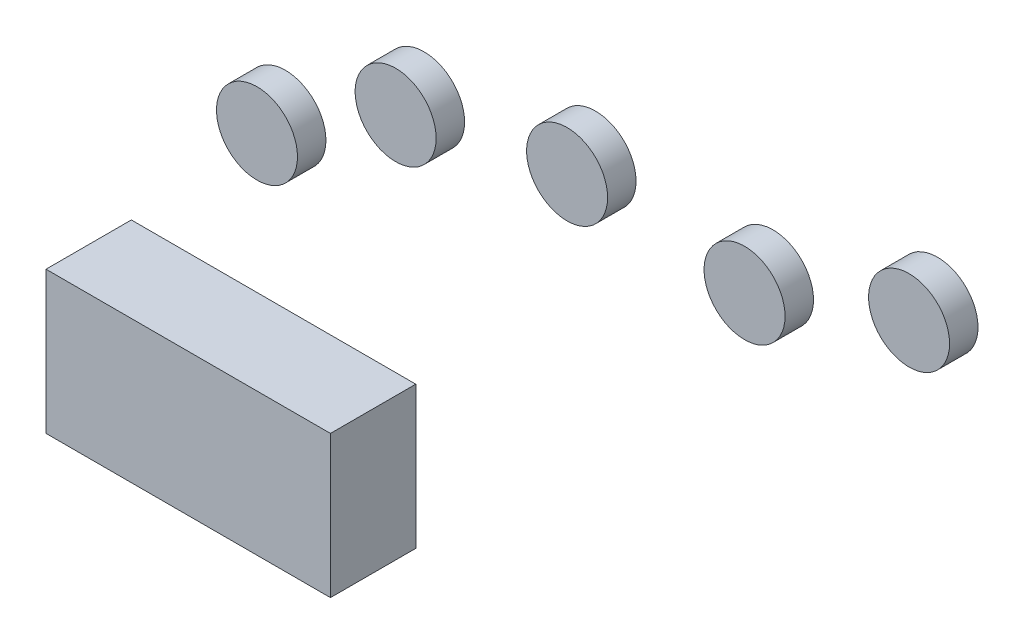
ISO-10303-21;
HEADER;
FILE_DESCRIPTION(('STEP AP214'),'2;1');
FILE_NAME('part.step','',(''),(''),'','','');
FILE_SCHEMA(('AUTOMOTIVE_DESIGN { 1 0 10303 214 1 1 1 1 }'));
ENDSEC;
DATA;
#1=APPLICATION_CONTEXT('core data for automotive mechanical design processes');
#2=APPLICATION_PROTOCOL_DEFINITION('international standard','automotive_design',2000,#1);
#3=PRODUCT_CONTEXT('',#1,'mechanical');
#4=PRODUCT('Part','Part','',(#3));
#5=PRODUCT_RELATED_PRODUCT_CATEGORY('part','',(#4));
#6=PRODUCT_DEFINITION_FORMATION('','',#4);
#7=PRODUCT_DEFINITION_CONTEXT('part definition',#1,'design');
#8=PRODUCT_DEFINITION('design','',#6,#7);
#9=PRODUCT_DEFINITION_SHAPE('','',#8);
#10=(LENGTH_UNIT() NAMED_UNIT(*) SI_UNIT(.MILLI.,.METRE.));
#11=(NAMED_UNIT(*) PLANE_ANGLE_UNIT() SI_UNIT($,.RADIAN.));
#12=(NAMED_UNIT(*) SI_UNIT($,.STERADIAN.) SOLID_ANGLE_UNIT());
#13=UNCERTAINTY_MEASURE_WITH_UNIT(LENGTH_MEASURE(1.E-05),#10,'distance_accuracy_value','');
#14=(GEOMETRIC_REPRESENTATION_CONTEXT(3) GLOBAL_UNCERTAINTY_ASSIGNED_CONTEXT((#13)) GLOBAL_UNIT_ASSIGNED_CONTEXT((#10,
#11,#12)) REPRESENTATION_CONTEXT('',''));
#15=CARTESIAN_POINT('',(0.,0.,0.));
#16=DIRECTION('',(0.,0.,1.));
#17=DIRECTION('',(1.,0.,0.));
#18=AXIS2_PLACEMENT_3D('',#15,#16,#17);
#19=CARTESIAN_POINT('',(45.8262413831108,41.5713817893675,130.));
#20=DIRECTION('',(1.,0.,0.));
#21=DIRECTION('',(0.,1.,0.));
#22=AXIS2_PLACEMENT_3D('',#19,#20,#21);
#23=PLANE('',#22);
#24=DIRECTION('',(0.,-1.,0.));
#25=VECTOR('',#24,1.);
#26=CARTESIAN_POINT('',(45.8262413831108,41.5713817893675,100.));
#27=LINE('',#26,#25);
#28=CARTESIAN_POINT('',(45.8262413831108,41.5713817893675,100.));
#29=VERTEX_POINT('',#28);
#30=CARTESIAN_POINT('',(45.8262413831108,-8.42861821063252,100.));
#31=VERTEX_POINT('',#30);
#32=EDGE_CURVE('E110',#29,#31,#27,.T.);
#33=ORIENTED_EDGE('',*,*,#32,.T.);
#34=DIRECTION('',(0.,0.,-1.));
#35=VECTOR('',#34,1.);
#36=CARTESIAN_POINT('',(45.8262413831108,-8.42861821063252,130.));
#37=LINE('',#36,#35);
#38=CARTESIAN_POINT('',(45.8262413831108,-8.42861821063252,130.));
#39=VERTEX_POINT('',#38);
#40=EDGE_CURVE('E13',#39,#31,#37,.T.);
#41=ORIENTED_EDGE('',*,*,#40,.F.);
#42=DIRECTION('',(0.,-1.,0.));
#43=VECTOR('',#42,1.);
#44=CARTESIAN_POINT('',(45.8262413831108,41.5713817893675,130.));
#45=LINE('',#44,#43);
#46=CARTESIAN_POINT('',(45.8262413831108,41.5713817893675,130.));
#47=VERTEX_POINT('',#46);
#48=EDGE_CURVE('E98',#47,#39,#45,.T.);
#49=ORIENTED_EDGE('',*,*,#48,.F.);
#50=DIRECTION('',(0.,0.,-1.));
#51=VECTOR('',#50,1.);
#52=CARTESIAN_POINT('',(45.8262413831108,41.5713817893675,130.));
#53=LINE('',#52,#51);
#54=EDGE_CURVE('E106',#47,#29,#53,.T.);
#55=ORIENTED_EDGE('',*,*,#54,.T.);
#56=EDGE_LOOP('',(#33,#41,#49,#55));
#57=FACE_BOUND('',#56,.T.);
#58=ADVANCED_FACE('F47',(#57),#23,.F.);
#59=CARTESIAN_POINT('',(45.8262413831108,-8.42861821063252,130.));
#60=DIRECTION('',(0.,1.,0.));
#61=DIRECTION('',(0.,0.,1.));
#62=AXIS2_PLACEMENT_3D('',#59,#60,#61);
#63=PLANE('',#62);
#64=DIRECTION('',(1.,0.,0.));
#65=VECTOR('',#64,1.);
#66=CARTESIAN_POINT('',(45.8262413831108,-8.42861821063252,100.));
#67=LINE('',#66,#65);
#68=CARTESIAN_POINT('',(145.826241383111,-8.42861821063252,100.));
#69=VERTEX_POINT('',#68);
#70=EDGE_CURVE('E102',#31,#69,#67,.T.);
#71=ORIENTED_EDGE('',*,*,#70,.T.);
#72=DIRECTION('',(0.,0.,-1.));
#73=VECTOR('',#72,1.);
#74=CARTESIAN_POINT('',(145.826241383111,-8.42861821063252,130.));
#75=LINE('',#74,#73);
#76=CARTESIAN_POINT('',(145.826241383111,-8.42861821063252,130.));
#77=VERTEX_POINT('',#76);
#78=EDGE_CURVE('E55',#77,#69,#75,.T.);
#79=ORIENTED_EDGE('',*,*,#78,.F.);
#80=DIRECTION('',(1.,0.,0.));
#81=VECTOR('',#80,1.);
#82=CARTESIAN_POINT('',(45.8262413831108,-8.42861821063252,130.));
#83=LINE('',#82,#81);
#84=EDGE_CURVE('E93',#39,#77,#83,.T.);
#85=ORIENTED_EDGE('',*,*,#84,.F.);
#86=ORIENTED_EDGE('',*,*,#40,.T.);
#87=EDGE_LOOP('',(#71,#79,#85,#86));
#88=FACE_BOUND('',#87,.T.);
#89=ADVANCED_FACE('F101',(#88),#63,.F.);
#90=CARTESIAN_POINT('',(145.826241383111,41.5713817893675,130.));
#91=DIRECTION('',(-1.,0.,0.));
#92=DIRECTION('',(0.,0.,1.));
#93=AXIS2_PLACEMENT_3D('',#90,#91,#92);
#94=PLANE('',#93);
#95=DIRECTION('',(0.,1.,0.));
#96=VECTOR('',#95,1.);
#97=CARTESIAN_POINT('',(145.826241383111,41.5713817893675,100.));
#98=LINE('',#97,#96);
#99=CARTESIAN_POINT('',(145.826241383111,41.5713817893675,100.));
#100=VERTEX_POINT('',#99);
#101=EDGE_CURVE('E80',#69,#100,#98,.T.);
#102=ORIENTED_EDGE('',*,*,#101,.T.);
#103=DIRECTION('',(0.,0.,-1.));
#104=VECTOR('',#103,1.);
#105=CARTESIAN_POINT('',(145.826241383111,41.5713817893675,130.));
#106=LINE('',#105,#104);
#107=CARTESIAN_POINT('',(145.826241383111,41.5713817893675,130.));
#108=VERTEX_POINT('',#107);
#109=EDGE_CURVE('E103',#108,#100,#106,.T.);
#110=ORIENTED_EDGE('',*,*,#109,.F.);
#111=DIRECTION('',(0.,1.,0.));
#112=VECTOR('',#111,1.);
#113=CARTESIAN_POINT('',(145.826241383111,41.5713817893675,130.));
#114=LINE('',#113,#112);
#115=EDGE_CURVE('E96',#77,#108,#114,.T.);
#116=ORIENTED_EDGE('',*,*,#115,.F.);
#117=ORIENTED_EDGE('',*,*,#78,.T.);
#118=EDGE_LOOP('',(#102,#110,#116,#117));
#119=FACE_BOUND('',#118,.T.);
#120=ADVANCED_FACE('F104',(#119),#94,.F.);
#121=CARTESIAN_POINT('',(45.8262413831108,41.5713817893675,130.));
#122=DIRECTION('',(0.,-1.,0.));
#123=DIRECTION('',(0.,0.,-1.));
#124=AXIS2_PLACEMENT_3D('',#121,#122,#123);
#125=PLANE('',#124);
#126=DIRECTION('',(-1.,0.,0.));
#127=VECTOR('',#126,1.);
#128=CARTESIAN_POINT('',(45.8262413831108,41.5713817893675,100.));
#129=LINE('',#128,#127);
#130=EDGE_CURVE('E86',#100,#29,#129,.T.);
#131=ORIENTED_EDGE('',*,*,#130,.T.);
#132=ORIENTED_EDGE('',*,*,#54,.F.);
#133=DIRECTION('',(-1.,0.,0.));
#134=VECTOR('',#133,1.);
#135=CARTESIAN_POINT('',(45.8262413831108,41.5713817893675,130.));
#136=LINE('',#135,#134);
#137=EDGE_CURVE('E63',#108,#47,#136,.T.);
#138=ORIENTED_EDGE('',*,*,#137,.F.);
#139=ORIENTED_EDGE('',*,*,#109,.T.);
#140=EDGE_LOOP('',(#131,#132,#138,#139));
#141=FACE_BOUND('',#140,.T.);
#142=ADVANCED_FACE('F117',(#141),#125,.F.);
#143=CARTESIAN_POINT('',(0.,0.,130.));
#144=DIRECTION('',(0.,0.,1.));
#145=DIRECTION('',(1.,0.,0.));
#146=AXIS2_PLACEMENT_3D('',#143,#144,#145);
#147=PLANE('',#146);
#148=ORIENTED_EDGE('',*,*,#48,.T.);
#149=ORIENTED_EDGE('',*,*,#84,.T.);
#150=ORIENTED_EDGE('',*,*,#115,.T.);
#151=ORIENTED_EDGE('',*,*,#137,.T.);
#152=EDGE_LOOP('',(#148,#149,#150,#151));
#153=FACE_BOUND('',#152,.T.);
#154=ADVANCED_FACE('F94',(#153),#147,.T.);
#155=CARTESIAN_POINT('',(0.,0.,100.));
#156=DIRECTION('',(0.,0.,1.));
#157=DIRECTION('',(1.,0.,0.));
#158=AXIS2_PLACEMENT_3D('',#155,#156,#157);
#159=PLANE('',#158);
#160=ORIENTED_EDGE('',*,*,#32,.F.);
#161=ORIENTED_EDGE('',*,*,#130,.F.);
#162=ORIENTED_EDGE('',*,*,#101,.F.);
#163=ORIENTED_EDGE('',*,*,#70,.F.);
#164=EDGE_LOOP('',(#160,#161,#162,#163));
#165=FACE_BOUND('',#164,.T.);
#166=ADVANCED_FACE('F120',(#165),#159,.F.);
#167=CLOSED_SHELL('',(#58,#89,#120,#142,#154,#166));
#168=MANIFOLD_SOLID_BREP('B2',#167);
#169=CARTESIAN_POINT('',(229.249642156903,57.7120011103998,10.));
#170=DIRECTION('',(0.,0.,-1.));
#171=DIRECTION('',(-1.,0.,0.));
#172=AXIS2_PLACEMENT_3D('',#169,#170,#171);
#173=CYLINDRICAL_SURFACE('',#172,14.2333439989628);
#174=CARTESIAN_POINT('',(229.249642156903,57.7120011103998,10.));
#175=DIRECTION('',(0.,0.,1.));
#176=DIRECTION('',(1.,0.,0.));
#177=AXIS2_PLACEMENT_3D('',#174,#175,#176);
#178=CIRCLE('',#177,14.2333439989628);
#179=CARTESIAN_POINT('',(243.482986155866,57.7120011103998,10.));
#180=VERTEX_POINT('',#179);
#181=EDGE_CURVE('E46',#180,#180,#178,.T.);
#182=ORIENTED_EDGE('',*,*,#181,.F.);
#183=EDGE_LOOP('',(#182));
#184=FACE_BOUND('',#183,.T.);
#185=CARTESIAN_POINT('',(229.249642156903,57.7120011103998,0.));
#186=DIRECTION('',(0.,0.,1.));
#187=DIRECTION('',(1.,0.,0.));
#188=AXIS2_PLACEMENT_3D('',#185,#186,#187);
#189=CIRCLE('',#188,14.2333439989628);
#190=CARTESIAN_POINT('',(243.482986155866,57.7120011103998,0.));
#191=VERTEX_POINT('',#190);
#192=EDGE_CURVE('E182',#191,#191,#189,.T.);
#193=ORIENTED_EDGE('',*,*,#192,.T.);
#194=EDGE_LOOP('',(#193));
#195=FACE_BOUND('',#194,.T.);
#196=ADVANCED_FACE('F179',(#184,#195),#173,.T.);
#197=CARTESIAN_POINT('',(229.249642156903,57.7120011103998,10.));
#198=DIRECTION('',(0.,0.,1.));
#199=DIRECTION('',(1.,0.,0.));
#200=AXIS2_PLACEMENT_3D('',#197,#198,#199);
#201=PLANE('',#200);
#202=ORIENTED_EDGE('',*,*,#181,.T.);
#203=EDGE_LOOP('',(#202));
#204=FACE_BOUND('',#203,.T.);
#205=ADVANCED_FACE('F194',(#204),#201,.T.);
#206=CARTESIAN_POINT('',(229.249642156903,57.7120011103998,0.));
#207=DIRECTION('',(0.,0.,1.));
#208=DIRECTION('',(1.,0.,0.));
#209=AXIS2_PLACEMENT_3D('',#206,#207,#208);
#210=PLANE('',#209);
#211=ORIENTED_EDGE('',*,*,#192,.F.);
#212=EDGE_LOOP('',(#211));
#213=FACE_BOUND('',#212,.T.);
#214=ADVANCED_FACE('F192',(#213),#210,.F.);
#215=CLOSED_SHELL('',(#196,#205,#214));
#216=MANIFOLD_SOLID_BREP('B7',#215);
#217=CARTESIAN_POINT('',(171.415989902593,37.1307354491045,10.));
#218=DIRECTION('',(0.,0.,-1.));
#219=DIRECTION('',(-1.,0.,0.));
#220=AXIS2_PLACEMENT_3D('',#217,#218,#219);
#221=CYLINDRICAL_SURFACE('',#220,14.2333439989628);
#222=CARTESIAN_POINT('',(171.415989902593,37.1307354491045,10.));
#223=DIRECTION('',(0.,0.,1.));
#224=DIRECTION('',(1.,0.,0.));
#225=AXIS2_PLACEMENT_3D('',#222,#223,#224);
#226=CIRCLE('',#225,14.2333439989628);
#227=CARTESIAN_POINT('',(185.649333901556,37.1307354491045,10.));
#228=VERTEX_POINT('',#227);
#229=EDGE_CURVE('E178',#228,#228,#226,.T.);
#230=ORIENTED_EDGE('',*,*,#229,.F.);
#231=EDGE_LOOP('',(#230));
#232=FACE_BOUND('',#231,.T.);
#233=CARTESIAN_POINT('',(171.415989902593,37.1307354491045,0.));
#234=DIRECTION('',(0.,0.,1.));
#235=DIRECTION('',(1.,0.,0.));
#236=AXIS2_PLACEMENT_3D('',#233,#234,#235);
#237=CIRCLE('',#236,14.2333439989628);
#238=CARTESIAN_POINT('',(185.649333901556,37.1307354491045,0.));
#239=VERTEX_POINT('',#238);
#240=EDGE_CURVE('E231',#239,#239,#237,.T.);
#241=ORIENTED_EDGE('',*,*,#240,.T.);
#242=EDGE_LOOP('',(#241));
#243=FACE_BOUND('',#242,.T.);
#244=ADVANCED_FACE('F228',(#232,#243),#221,.T.);
#245=CARTESIAN_POINT('',(171.415989902593,37.1307354491045,10.));
#246=DIRECTION('',(0.,0.,1.));
#247=DIRECTION('',(1.,0.,0.));
#248=AXIS2_PLACEMENT_3D('',#245,#246,#247);
#249=PLANE('',#248);
#250=ORIENTED_EDGE('',*,*,#229,.T.);
#251=EDGE_LOOP('',(#250));
#252=FACE_BOUND('',#251,.T.);
#253=ADVANCED_FACE('F243',(#252),#249,.T.);
#254=CARTESIAN_POINT('',(171.415989902593,37.1307354491045,0.));
#255=DIRECTION('',(0.,0.,1.));
#256=DIRECTION('',(1.,0.,0.));
#257=AXIS2_PLACEMENT_3D('',#254,#255,#256);
#258=PLANE('',#257);
#259=ORIENTED_EDGE('',*,*,#240,.F.);
#260=EDGE_LOOP('',(#259));
#261=FACE_BOUND('',#260,.T.);
#262=ADVANCED_FACE('F241',(#261),#258,.F.);
#263=CLOSED_SHELL('',(#244,#253,#262));
#264=MANIFOLD_SOLID_BREP('B41',#263);
#265=CARTESIAN_POINT('',(109.02470303709,42.0842931127341,10.));
#266=DIRECTION('',(0.,0.,-1.));
#267=DIRECTION('',(-1.,0.,0.));
#268=AXIS2_PLACEMENT_3D('',#265,#266,#267);
#269=CYLINDRICAL_SURFACE('',#268,14.2333439989628);
#270=CARTESIAN_POINT('',(109.02470303709,42.0842931127341,10.));
#271=DIRECTION('',(0.,0.,1.));
#272=DIRECTION('',(1.,0.,0.));
#273=AXIS2_PLACEMENT_3D('',#270,#271,#272);
#274=CIRCLE('',#273,14.2333439989628);
#275=CARTESIAN_POINT('',(123.258047036053,42.0842931127341,10.));
#276=VERTEX_POINT('',#275);
#277=EDGE_CURVE('E227',#276,#276,#274,.T.);
#278=ORIENTED_EDGE('',*,*,#277,.F.);
#279=EDGE_LOOP('',(#278));
#280=FACE_BOUND('',#279,.T.);
#281=CARTESIAN_POINT('',(109.02470303709,42.0842931127341,0.));
#282=DIRECTION('',(0.,0.,1.));
#283=DIRECTION('',(1.,0.,0.));
#284=AXIS2_PLACEMENT_3D('',#281,#282,#283);
#285=CIRCLE('',#284,14.2333439989628);
#286=CARTESIAN_POINT('',(123.258047036053,42.0842931127341,0.));
#287=VERTEX_POINT('',#286);
#288=EDGE_CURVE('E280',#287,#287,#285,.T.);
#289=ORIENTED_EDGE('',*,*,#288,.T.);
#290=EDGE_LOOP('',(#289));
#291=FACE_BOUND('',#290,.T.);
#292=ADVANCED_FACE('F277',(#280,#291),#269,.T.);
#293=CARTESIAN_POINT('',(109.02470303709,42.0842931127341,10.));
#294=DIRECTION('',(0.,0.,1.));
#295=DIRECTION('',(1.,0.,0.));
#296=AXIS2_PLACEMENT_3D('',#293,#294,#295);
#297=PLANE('',#296);
#298=ORIENTED_EDGE('',*,*,#277,.T.);
#299=EDGE_LOOP('',(#298));
#300=FACE_BOUND('',#299,.T.);
#301=ADVANCED_FACE('F292',(#300),#297,.T.);
#302=CARTESIAN_POINT('',(109.02470303709,42.0842931127341,0.));
#303=DIRECTION('',(0.,0.,1.));
#304=DIRECTION('',(1.,0.,0.));
#305=AXIS2_PLACEMENT_3D('',#302,#303,#304);
#306=PLANE('',#305);
#307=ORIENTED_EDGE('',*,*,#288,.F.);
#308=EDGE_LOOP('',(#307));
#309=FACE_BOUND('',#308,.T.);
#310=ADVANCED_FACE('F290',(#309),#306,.F.);
#311=CLOSED_SHELL('',(#292,#301,#310));
#312=MANIFOLD_SOLID_BREP('B173',#311);
#313=CARTESIAN_POINT('',(48.7459322509069,29.9938695173619,10.));
#314=DIRECTION('',(0.,0.,-1.));
#315=DIRECTION('',(-1.,0.,0.));
#316=AXIS2_PLACEMENT_3D('',#313,#314,#315);
#317=CYLINDRICAL_SURFACE('',#316,14.2333439989628);
#318=CARTESIAN_POINT('',(48.7459322509069,29.9938695173619,10.));
#319=DIRECTION('',(0.,0.,1.));
#320=DIRECTION('',(1.,0.,0.));
#321=AXIS2_PLACEMENT_3D('',#318,#319,#320);
#322=CIRCLE('',#321,14.2333439989628);
#323=CARTESIAN_POINT('',(62.9792762498697,29.9938695173619,10.));
#324=VERTEX_POINT('',#323);
#325=EDGE_CURVE('E276',#324,#324,#322,.T.);
#326=ORIENTED_EDGE('',*,*,#325,.F.);
#327=EDGE_LOOP('',(#326));
#328=FACE_BOUND('',#327,.T.);
#329=CARTESIAN_POINT('',(48.7459322509069,29.9938695173619,0.));
#330=DIRECTION('',(0.,0.,1.));
#331=DIRECTION('',(1.,0.,0.));
#332=AXIS2_PLACEMENT_3D('',#329,#330,#331);
#333=CIRCLE('',#332,14.2333439989628);
#334=CARTESIAN_POINT('',(62.9792762498697,29.9938695173619,0.));
#335=VERTEX_POINT('',#334);
#336=EDGE_CURVE('E328',#335,#335,#333,.T.);
#337=ORIENTED_EDGE('',*,*,#336,.T.);
#338=EDGE_LOOP('',(#337));
#339=FACE_BOUND('',#338,.T.);
#340=ADVANCED_FACE('F325',(#328,#339),#317,.T.);
#341=CARTESIAN_POINT('',(48.7459322509069,29.9938695173619,10.));
#342=DIRECTION('',(0.,0.,1.));
#343=DIRECTION('',(1.,0.,0.));
#344=AXIS2_PLACEMENT_3D('',#341,#342,#343);
#345=PLANE('',#344);
#346=ORIENTED_EDGE('',*,*,#325,.T.);
#347=EDGE_LOOP('',(#346));
#348=FACE_BOUND('',#347,.T.);
#349=ADVANCED_FACE('F340',(#348),#345,.T.);
#350=CARTESIAN_POINT('',(48.7459322509069,29.9938695173619,0.));
#351=DIRECTION('',(0.,0.,1.));
#352=DIRECTION('',(1.,0.,0.));
#353=AXIS2_PLACEMENT_3D('',#350,#351,#352);
#354=PLANE('',#353);
#355=ORIENTED_EDGE('',*,*,#336,.F.);
#356=EDGE_LOOP('',(#355));
#357=FACE_BOUND('',#356,.T.);
#358=ADVANCED_FACE('F338',(#357),#354,.F.);
#359=CLOSED_SHELL('',(#340,#349,#358));
#360=MANIFOLD_SOLID_BREP('B222',#359);
#361=CARTESIAN_POINT('',(0.,0.,10.));
#362=DIRECTION('',(0.,0.,-1.));
#363=DIRECTION('',(-1.,0.,0.));
#364=AXIS2_PLACEMENT_3D('',#361,#362,#363);
#365=CYLINDRICAL_SURFACE('',#364,14.2333439989628);
#366=CARTESIAN_POINT('',(0.,0.,10.));
#367=DIRECTION('',(0.,0.,1.));
#368=DIRECTION('',(1.,0.,0.));
#369=AXIS2_PLACEMENT_3D('',#366,#367,#368);
#370=CIRCLE('',#369,14.2333439989628);
#371=CARTESIAN_POINT('',(14.2333439989628,0.,10.));
#372=VERTEX_POINT('',#371);
#373=EDGE_CURVE('E324',#372,#372,#370,.T.);
#374=ORIENTED_EDGE('',*,*,#373,.F.);
#375=EDGE_LOOP('',(#374));
#376=FACE_BOUND('',#375,.T.);
#377=CARTESIAN_POINT('',(0.,0.,0.));
#378=DIRECTION('',(0.,0.,1.));
#379=DIRECTION('',(1.,0.,0.));
#380=AXIS2_PLACEMENT_3D('',#377,#378,#379);
#381=CIRCLE('',#380,14.2333439989628);
#382=CARTESIAN_POINT('',(14.2333439989628,0.,0.));
#383=VERTEX_POINT('',#382);
#384=EDGE_CURVE('E369',#383,#383,#381,.T.);
#385=ORIENTED_EDGE('',*,*,#384,.T.);
#386=EDGE_LOOP('',(#385));
#387=FACE_BOUND('',#386,.T.);
#388=ADVANCED_FACE('F366',(#376,#387),#365,.T.);
#389=CARTESIAN_POINT('',(0.,0.,10.));
#390=DIRECTION('',(0.,0.,1.));
#391=DIRECTION('',(1.,0.,0.));
#392=AXIS2_PLACEMENT_3D('',#389,#390,#391);
#393=PLANE('',#392);
#394=ORIENTED_EDGE('',*,*,#373,.T.);
#395=EDGE_LOOP('',(#394));
#396=FACE_BOUND('',#395,.T.);
#397=ADVANCED_FACE('F381',(#396),#393,.T.);
#398=CARTESIAN_POINT('',(0.,0.,0.));
#399=DIRECTION('',(0.,0.,1.));
#400=DIRECTION('',(1.,0.,0.));
#401=AXIS2_PLACEMENT_3D('',#398,#399,#400);
#402=PLANE('',#401);
#403=ORIENTED_EDGE('',*,*,#384,.F.);
#404=EDGE_LOOP('',(#403));
#405=FACE_BOUND('',#404,.T.);
#406=ADVANCED_FACE('F379',(#405),#402,.F.);
#407=CLOSED_SHELL('',(#388,#397,#406));
#408=MANIFOLD_SOLID_BREP('B271',#407);
#409=ADVANCED_BREP_SHAPE_REPRESENTATION('',(#18,#168,#216,#264,#312,#360,#408),#14);
#410=SHAPE_DEFINITION_REPRESENTATION(#9,#409);
ENDSEC;
END-ISO-10303-21;
